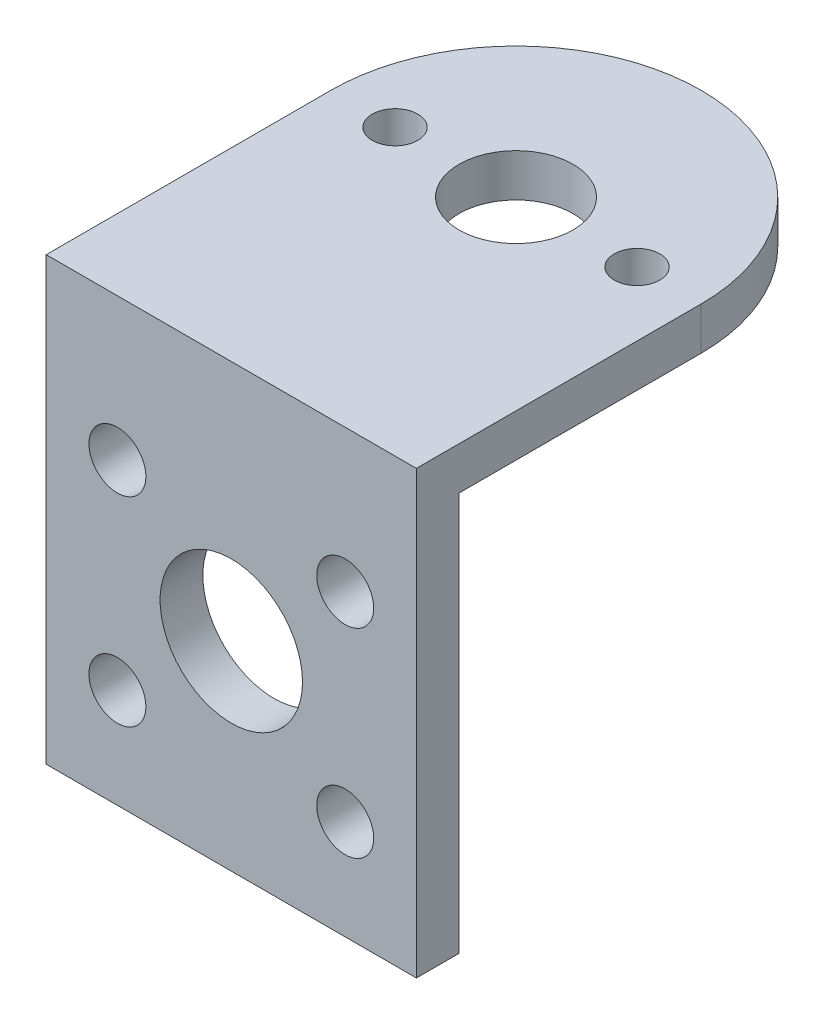
ISO-10303-21;
HEADER;
FILE_DESCRIPTION(('STEP AP214'),'2;1');
FILE_NAME('part.step','',(''),(''),'','','');
FILE_SCHEMA(('AUTOMOTIVE_DESIGN { 1 0 10303 214 1 1 1 1 }'));
ENDSEC;
DATA;
#1=APPLICATION_CONTEXT('core data for automotive mechanical design processes');
#2=APPLICATION_PROTOCOL_DEFINITION('international standard','automotive_design',2000,#1);
#3=PRODUCT_CONTEXT('',#1,'mechanical');
#4=PRODUCT('Part','Part','',(#3));
#5=PRODUCT_RELATED_PRODUCT_CATEGORY('part','',(#4));
#6=PRODUCT_DEFINITION_FORMATION('','',#4);
#7=PRODUCT_DEFINITION_CONTEXT('part definition',#1,'design');
#8=PRODUCT_DEFINITION('design','',#6,#7);
#9=PRODUCT_DEFINITION_SHAPE('','',#8);
#10=(LENGTH_UNIT() NAMED_UNIT(*) SI_UNIT(.MILLI.,.METRE.));
#11=(NAMED_UNIT(*) PLANE_ANGLE_UNIT() SI_UNIT($,.RADIAN.));
#12=(NAMED_UNIT(*) SI_UNIT($,.STERADIAN.) SOLID_ANGLE_UNIT());
#13=UNCERTAINTY_MEASURE_WITH_UNIT(LENGTH_MEASURE(1.E-05),#10,'distance_accuracy_value','');
#14=(GEOMETRIC_REPRESENTATION_CONTEXT(3) GLOBAL_UNCERTAINTY_ASSIGNED_CONTEXT((#13)) GLOBAL_UNIT_ASSIGNED_CONTEXT((#10,
#11,#12)) REPRESENTATION_CONTEXT('',''));
#15=CARTESIAN_POINT('',(0.,0.,0.));
#16=DIRECTION('',(0.,0.,1.));
#17=DIRECTION('',(1.,0.,0.));
#18=AXIS2_PLACEMENT_3D('',#15,#16,#17);
#19=CARTESIAN_POINT('',(0.,0.,0.));
#20=DIRECTION('',(0.,1.,0.));
#21=DIRECTION('',(0.,0.,1.));
#22=AXIS2_PLACEMENT_3D('',#19,#20,#21);
#23=PLANE('',#22);
#24=CARTESIAN_POINT('',(8.5,0.,0.));
#25=DIRECTION('',(0.,1.,0.));
#26=DIRECTION('',(0.,0.,1.));
#27=AXIS2_PLACEMENT_3D('',#24,#25,#26);
#28=CIRCLE('',#27,1.6);
#29=CARTESIAN_POINT('',(8.5,0.,1.6));
#30=VERTEX_POINT('',#29);
#31=EDGE_CURVE('E147',#30,#30,#28,.T.);
#32=ORIENTED_EDGE('',*,*,#31,.T.);
#33=EDGE_LOOP('',(#32));
#34=FACE_BOUND('',#33,.T.);
#35=CARTESIAN_POINT('',(0.,0.,0.));
#36=DIRECTION('',(0.,1.,0.));
#37=DIRECTION('',(0.,0.,1.));
#38=AXIS2_PLACEMENT_3D('',#35,#36,#37);
#39=CIRCLE('',#38,4.);
#40=CARTESIAN_POINT('',(0.,0.,4.));
#41=VERTEX_POINT('',#40);
#42=EDGE_CURVE('E157',#41,#41,#39,.T.);
#43=ORIENTED_EDGE('',*,*,#42,.T.);
#44=EDGE_LOOP('',(#43));
#45=FACE_BOUND('',#44,.T.);
#46=CARTESIAN_POINT('',(-8.5,0.,0.));
#47=DIRECTION('',(0.,1.,0.));
#48=DIRECTION('',(0.,0.,1.));
#49=AXIS2_PLACEMENT_3D('',#46,#47,#48);
#50=CIRCLE('',#49,1.6);
#51=CARTESIAN_POINT('',(-8.5,0.,1.6));
#52=VERTEX_POINT('',#51);
#53=EDGE_CURVE('E151',#52,#52,#50,.T.);
#54=ORIENTED_EDGE('',*,*,#53,.T.);
#55=EDGE_LOOP('',(#54));
#56=FACE_BOUND('',#55,.T.);
#57=DIRECTION('',(1.,0.,0.));
#58=VECTOR('',#57,1.);
#59=CARTESIAN_POINT('',(0.,0.,17.));
#60=LINE('',#59,#58);
#61=CARTESIAN_POINT('',(-13.,0.,17.));
#62=VERTEX_POINT('',#61);
#63=CARTESIAN_POINT('',(13.,0.,17.));
#64=VERTEX_POINT('',#63);
#65=EDGE_CURVE('E133',#62,#64,#60,.T.);
#66=ORIENTED_EDGE('',*,*,#65,.F.);
#67=DIRECTION('',(0.,0.,1.));
#68=VECTOR('',#67,1.);
#69=CARTESIAN_POINT('',(-13.,0.,0.));
#70=LINE('',#69,#68);
#71=CARTESIAN_POINT('',(-13.,0.,0.));
#72=VERTEX_POINT('',#71);
#73=EDGE_CURVE('E63',#72,#62,#70,.T.);
#74=ORIENTED_EDGE('',*,*,#73,.F.);
#75=CARTESIAN_POINT('',(0.,0.,0.));
#76=DIRECTION('',(0.,1.,0.));
#77=DIRECTION('',(0.,0.,1.));
#78=AXIS2_PLACEMENT_3D('',#75,#76,#77);
#79=CIRCLE('',#78,13.);
#80=CARTESIAN_POINT('',(13.,0.,0.));
#81=VERTEX_POINT('',#80);
#82=EDGE_CURVE('E110',#81,#72,#79,.T.);
#83=ORIENTED_EDGE('',*,*,#82,.F.);
#84=DIRECTION('',(0.,0.,-1.));
#85=VECTOR('',#84,1.);
#86=CARTESIAN_POINT('',(13.,0.,19.9999999999999));
#87=LINE('',#86,#85);
#88=EDGE_CURVE('E115',#64,#81,#87,.T.);
#89=ORIENTED_EDGE('',*,*,#88,.F.);
#90=EDGE_LOOP('',(#66,#74,#83,#89));
#91=FACE_BOUND('',#90,.T.);
#92=ADVANCED_FACE('F34',(#34,#45,#56,#91),#23,.F.);
#93=CARTESIAN_POINT('',(0.,3.,0.));
#94=DIRECTION('',(0.,1.,0.));
#95=DIRECTION('',(0.,0.,1.));
#96=AXIS2_PLACEMENT_3D('',#93,#94,#95);
#97=PLANE('',#96);
#98=DIRECTION('',(0.,0.,-1.));
#99=VECTOR('',#98,1.);
#100=CARTESIAN_POINT('',(13.,3.,19.9999999999999));
#101=LINE('',#100,#99);
#102=CARTESIAN_POINT('',(13.,3.,19.9999999999999));
#103=VERTEX_POINT('',#102);
#104=CARTESIAN_POINT('',(13.,3.,0.));
#105=VERTEX_POINT('',#104);
#106=EDGE_CURVE('E51',#103,#105,#101,.T.);
#107=ORIENTED_EDGE('',*,*,#106,.T.);
#108=CARTESIAN_POINT('',(0.,3.,0.));
#109=DIRECTION('',(0.,1.,0.));
#110=DIRECTION('',(0.,0.,1.));
#111=AXIS2_PLACEMENT_3D('',#108,#109,#110);
#112=CIRCLE('',#111,13.);
#113=CARTESIAN_POINT('',(-13.,3.,0.));
#114=VERTEX_POINT('',#113);
#115=EDGE_CURVE('E88',#105,#114,#112,.T.);
#116=ORIENTED_EDGE('',*,*,#115,.T.);
#117=DIRECTION('',(0.,0.,1.));
#118=VECTOR('',#117,1.);
#119=CARTESIAN_POINT('',(-13.,3.,0.));
#120=LINE('',#119,#118);
#121=CARTESIAN_POINT('',(-13.,3.,20.));
#122=VERTEX_POINT('',#121);
#123=EDGE_CURVE('E80',#114,#122,#120,.T.);
#124=ORIENTED_EDGE('',*,*,#123,.T.);
#125=DIRECTION('',(1.,0.,0.));
#126=VECTOR('',#125,1.);
#127=CARTESIAN_POINT('',(-13.,3.,20.));
#128=LINE('',#127,#126);
#129=EDGE_CURVE('E85',#122,#103,#128,.T.);
#130=ORIENTED_EDGE('',*,*,#129,.T.);
#131=EDGE_LOOP('',(#107,#116,#124,#130));
#132=FACE_BOUND('',#131,.T.);
#133=CARTESIAN_POINT('',(8.5,3.,0.));
#134=DIRECTION('',(0.,1.,0.));
#135=DIRECTION('',(0.,0.,1.));
#136=AXIS2_PLACEMENT_3D('',#133,#134,#135);
#137=CIRCLE('',#136,1.6);
#138=CARTESIAN_POINT('',(8.5,3.,1.6));
#139=VERTEX_POINT('',#138);
#140=EDGE_CURVE('E148',#139,#139,#137,.T.);
#141=ORIENTED_EDGE('',*,*,#140,.F.);
#142=EDGE_LOOP('',(#141));
#143=FACE_BOUND('',#142,.T.);
#144=CARTESIAN_POINT('',(0.,3.,0.));
#145=DIRECTION('',(0.,1.,0.));
#146=DIRECTION('',(0.,0.,1.));
#147=AXIS2_PLACEMENT_3D('',#144,#145,#146);
#148=CIRCLE('',#147,4.);
#149=CARTESIAN_POINT('',(0.,3.,4.));
#150=VERTEX_POINT('',#149);
#151=EDGE_CURVE('E113',#150,#150,#148,.T.);
#152=ORIENTED_EDGE('',*,*,#151,.F.);
#153=EDGE_LOOP('',(#152));
#154=FACE_BOUND('',#153,.T.);
#155=CARTESIAN_POINT('',(-8.5,3.,0.));
#156=DIRECTION('',(0.,1.,0.));
#157=DIRECTION('',(0.,0.,1.));
#158=AXIS2_PLACEMENT_3D('',#155,#156,#157);
#159=CIRCLE('',#158,1.6);
#160=CARTESIAN_POINT('',(-8.5,3.,1.6));
#161=VERTEX_POINT('',#160);
#162=EDGE_CURVE('E154',#161,#161,#159,.T.);
#163=ORIENTED_EDGE('',*,*,#162,.F.);
#164=EDGE_LOOP('',(#163));
#165=FACE_BOUND('',#164,.T.);
#166=ADVANCED_FACE('F82',(#132,#143,#154,#165),#97,.T.);
#167=CARTESIAN_POINT('',(0.,3.,0.));
#168=DIRECTION('',(0.,-1.,0.));
#169=DIRECTION('',(0.,0.,-1.));
#170=AXIS2_PLACEMENT_3D('',#167,#168,#169);
#171=CYLINDRICAL_SURFACE('',#170,13.);
#172=ORIENTED_EDGE('',*,*,#82,.T.);
#173=DIRECTION('',(0.,-1.,0.));
#174=VECTOR('',#173,1.);
#175=CARTESIAN_POINT('',(-13.,3.,0.));
#176=LINE('',#175,#174);
#177=EDGE_CURVE('E11',#114,#72,#176,.T.);
#178=ORIENTED_EDGE('',*,*,#177,.F.);
#179=ORIENTED_EDGE('',*,*,#115,.F.);
#180=DIRECTION('',(0.,-1.,0.));
#181=VECTOR('',#180,1.);
#182=CARTESIAN_POINT('',(13.,3.,0.));
#183=LINE('',#182,#181);
#184=EDGE_CURVE('E106',#105,#81,#183,.T.);
#185=ORIENTED_EDGE('',*,*,#184,.T.);
#186=EDGE_LOOP('',(#172,#178,#179,#185));
#187=FACE_BOUND('',#186,.T.);
#188=ADVANCED_FACE('F36',(#187),#171,.T.);
#189=CARTESIAN_POINT('',(-13.,3.,0.));
#190=DIRECTION('',(1.,0.,0.));
#191=DIRECTION('',(0.,0.,-1.));
#192=AXIS2_PLACEMENT_3D('',#189,#190,#191);
#193=PLANE('',#192);
#194=DIRECTION('',(0.,-1.,0.));
#195=VECTOR('',#194,1.);
#196=CARTESIAN_POINT('',(-13.,3.,20.));
#197=LINE('',#196,#195);
#198=CARTESIAN_POINT('',(-13.,-28.,20.));
#199=VERTEX_POINT('',#198);
#200=EDGE_CURVE('E43',#122,#199,#197,.T.);
#201=ORIENTED_EDGE('',*,*,#200,.F.);
#202=ORIENTED_EDGE('',*,*,#123,.F.);
#203=ORIENTED_EDGE('',*,*,#177,.T.);
#204=ORIENTED_EDGE('',*,*,#73,.T.);
#205=DIRECTION('',(0.,-1.,0.));
#206=VECTOR('',#205,1.);
#207=CARTESIAN_POINT('',(-13.,3.,17.));
#208=LINE('',#207,#206);
#209=CARTESIAN_POINT('',(-13.,-28.,17.));
#210=VERTEX_POINT('',#209);
#211=EDGE_CURVE('E73',#62,#210,#208,.T.);
#212=ORIENTED_EDGE('',*,*,#211,.T.);
#213=DIRECTION('',(0.,0.,1.));
#214=VECTOR('',#213,1.);
#215=CARTESIAN_POINT('',(-13.,-28.,17.));
#216=LINE('',#215,#214);
#217=EDGE_CURVE('E97',#210,#199,#216,.T.);
#218=ORIENTED_EDGE('',*,*,#217,.T.);
#219=EDGE_LOOP('',(#201,#202,#203,#204,#212,#218));
#220=FACE_BOUND('',#219,.T.);
#221=ADVANCED_FACE('F94',(#220),#193,.F.);
#222=CARTESIAN_POINT('',(-13.,3.,20.));
#223=DIRECTION('',(0.,0.,-1.));
#224=DIRECTION('',(-1.,0.,0.));
#225=AXIS2_PLACEMENT_3D('',#222,#223,#224);
#226=PLANE('',#225);
#227=ORIENTED_EDGE('',*,*,#200,.T.);
#228=DIRECTION('',(1.,0.,0.));
#229=VECTOR('',#228,1.);
#230=CARTESIAN_POINT('',(-13.,-28.,20.));
#231=LINE('',#230,#229);
#232=CARTESIAN_POINT('',(13.,-28.,20.));
#233=VERTEX_POINT('',#232);
#234=EDGE_CURVE('E130',#199,#233,#231,.T.);
#235=ORIENTED_EDGE('',*,*,#234,.T.);
#236=DIRECTION('',(0.,-1.,0.));
#237=VECTOR('',#236,1.);
#238=CARTESIAN_POINT('',(13.,3.,19.9999999999999));
#239=LINE('',#238,#237);
#240=EDGE_CURVE('E101',#103,#233,#239,.T.);
#241=ORIENTED_EDGE('',*,*,#240,.F.);
#242=ORIENTED_EDGE('',*,*,#129,.F.);
#243=EDGE_LOOP('',(#227,#235,#241,#242));
#244=FACE_BOUND('',#243,.T.);
#245=CARTESIAN_POINT('',(0.,-14.,20.));
#246=DIRECTION('',(0.,0.,1.));
#247=DIRECTION('',(1.,0.,0.));
#248=AXIS2_PLACEMENT_3D('',#245,#246,#247);
#249=CIRCLE('',#248,5.);
#250=CARTESIAN_POINT('',(5.00000000000008,-14.,20.));
#251=VERTEX_POINT('',#250);
#252=EDGE_CURVE('E139',#251,#251,#249,.T.);
#253=ORIENTED_EDGE('',*,*,#252,.F.);
#254=EDGE_LOOP('',(#253));
#255=FACE_BOUND('',#254,.T.);
#256=CARTESIAN_POINT('',(-7.99999999999992,-7.,20.));
#257=DIRECTION('',(0.,0.,1.));
#258=DIRECTION('',(1.,0.,0.));
#259=AXIS2_PLACEMENT_3D('',#256,#257,#258);
#260=CIRCLE('',#259,2.);
#261=CARTESIAN_POINT('',(-5.99999999999992,-7.,20.));
#262=VERTEX_POINT('',#261);
#263=EDGE_CURVE('E201',#262,#262,#260,.T.);
#264=ORIENTED_EDGE('',*,*,#263,.F.);
#265=EDGE_LOOP('',(#264));
#266=FACE_BOUND('',#265,.T.);
#267=CARTESIAN_POINT('',(8.00000000000008,-7.,20.));
#268=DIRECTION('',(0.,0.,1.));
#269=DIRECTION('',(1.,0.,0.));
#270=AXIS2_PLACEMENT_3D('',#267,#268,#269);
#271=CIRCLE('',#270,2.);
#272=CARTESIAN_POINT('',(10.0000000000001,-7.,20.));
#273=VERTEX_POINT('',#272);
#274=EDGE_CURVE('E207',#273,#273,#271,.T.);
#275=ORIENTED_EDGE('',*,*,#274,.F.);
#276=EDGE_LOOP('',(#275));
#277=FACE_BOUND('',#276,.T.);
#278=CARTESIAN_POINT('',(8.00000000000008,-21.,20.));
#279=DIRECTION('',(0.,0.,1.));
#280=DIRECTION('',(1.,0.,0.));
#281=AXIS2_PLACEMENT_3D('',#278,#279,#280);
#282=CIRCLE('',#281,2.);
#283=CARTESIAN_POINT('',(10.0000000000001,-21.,20.));
#284=VERTEX_POINT('',#283);
#285=EDGE_CURVE('E213',#284,#284,#282,.T.);
#286=ORIENTED_EDGE('',*,*,#285,.F.);
#287=EDGE_LOOP('',(#286));
#288=FACE_BOUND('',#287,.T.);
#289=CARTESIAN_POINT('',(-7.99999999999976,-21.,20.));
#290=DIRECTION('',(0.,0.,1.));
#291=DIRECTION('',(1.,0.,0.));
#292=AXIS2_PLACEMENT_3D('',#289,#290,#291);
#293=CIRCLE('',#292,2.);
#294=CARTESIAN_POINT('',(-5.99999999999976,-21.,20.));
#295=VERTEX_POINT('',#294);
#296=EDGE_CURVE('E219',#295,#295,#293,.T.);
#297=ORIENTED_EDGE('',*,*,#296,.F.);
#298=EDGE_LOOP('',(#297));
#299=FACE_BOUND('',#298,.T.);
#300=ADVANCED_FACE('F102',(#244,#255,#266,#277,#288,#299),#226,.F.);
#301=CARTESIAN_POINT('',(13.,3.,19.9999999999999));
#302=DIRECTION('',(-1.,0.,0.));
#303=DIRECTION('',(0.,0.,1.));
#304=AXIS2_PLACEMENT_3D('',#301,#302,#303);
#305=PLANE('',#304);
#306=ORIENTED_EDGE('',*,*,#240,.T.);
#307=DIRECTION('',(0.,0.,1.));
#308=VECTOR('',#307,1.);
#309=CARTESIAN_POINT('',(13.,-28.,17.));
#310=LINE('',#309,#308);
#311=CARTESIAN_POINT('',(13.,-28.,17.));
#312=VERTEX_POINT('',#311);
#313=EDGE_CURVE('E125',#312,#233,#310,.T.);
#314=ORIENTED_EDGE('',*,*,#313,.F.);
#315=DIRECTION('',(0.,1.,0.));
#316=VECTOR('',#315,1.);
#317=CARTESIAN_POINT('',(13.,-28.,17.));
#318=LINE('',#317,#316);
#319=EDGE_CURVE('E142',#312,#64,#318,.T.);
#320=ORIENTED_EDGE('',*,*,#319,.T.);
#321=ORIENTED_EDGE('',*,*,#88,.T.);
#322=ORIENTED_EDGE('',*,*,#184,.F.);
#323=ORIENTED_EDGE('',*,*,#106,.F.);
#324=EDGE_LOOP('',(#306,#314,#320,#321,#322,#323));
#325=FACE_BOUND('',#324,.T.);
#326=ADVANCED_FACE('F123',(#325),#305,.F.);
#327=CARTESIAN_POINT('',(0.,3.,0.));
#328=DIRECTION('',(0.,-1.,0.));
#329=DIRECTION('',(0.,0.,-1.));
#330=AXIS2_PLACEMENT_3D('',#327,#328,#329);
#331=CYLINDRICAL_SURFACE('',#330,4.);
#332=ORIENTED_EDGE('',*,*,#151,.T.);
#333=EDGE_LOOP('',(#332));
#334=FACE_BOUND('',#333,.T.);
#335=ORIENTED_EDGE('',*,*,#42,.F.);
#336=EDGE_LOOP('',(#335));
#337=FACE_BOUND('',#336,.T.);
#338=ADVANCED_FACE('F167',(#334,#337),#331,.F.);
#339=CARTESIAN_POINT('',(-8.5,3.,0.));
#340=DIRECTION('',(0.,-1.,0.));
#341=DIRECTION('',(0.,0.,-1.));
#342=AXIS2_PLACEMENT_3D('',#339,#340,#341);
#343=CYLINDRICAL_SURFACE('',#342,1.6);
#344=ORIENTED_EDGE('',*,*,#162,.T.);
#345=EDGE_LOOP('',(#344));
#346=FACE_BOUND('',#345,.T.);
#347=ORIENTED_EDGE('',*,*,#53,.F.);
#348=EDGE_LOOP('',(#347));
#349=FACE_BOUND('',#348,.T.);
#350=ADVANCED_FACE('F169',(#346,#349),#343,.F.);
#351=CARTESIAN_POINT('',(8.5,3.,0.));
#352=DIRECTION('',(0.,-1.,0.));
#353=DIRECTION('',(0.,0.,-1.));
#354=AXIS2_PLACEMENT_3D('',#351,#352,#353);
#355=CYLINDRICAL_SURFACE('',#354,1.6);
#356=ORIENTED_EDGE('',*,*,#140,.T.);
#357=EDGE_LOOP('',(#356));
#358=FACE_BOUND('',#357,.T.);
#359=ORIENTED_EDGE('',*,*,#31,.F.);
#360=EDGE_LOOP('',(#359));
#361=FACE_BOUND('',#360,.T.);
#362=ADVANCED_FACE('F176',(#358,#361),#355,.F.);
#363=CARTESIAN_POINT('',(0.,0.,17.));
#364=DIRECTION('',(0.,0.,1.));
#365=DIRECTION('',(1.,0.,0.));
#366=AXIS2_PLACEMENT_3D('',#363,#364,#365);
#367=PLANE('',#366);
#368=CARTESIAN_POINT('',(0.,-14.,17.));
#369=DIRECTION('',(0.,0.,1.));
#370=DIRECTION('',(1.,0.,0.));
#371=AXIS2_PLACEMENT_3D('',#368,#369,#370);
#372=CIRCLE('',#371,5.);
#373=CARTESIAN_POINT('',(5.00000000000008,-14.,17.));
#374=VERTEX_POINT('',#373);
#375=EDGE_CURVE('E135',#374,#374,#372,.T.);
#376=ORIENTED_EDGE('',*,*,#375,.T.);
#377=EDGE_LOOP('',(#376));
#378=FACE_BOUND('',#377,.T.);
#379=CARTESIAN_POINT('',(-7.99999999999992,-7.,17.));
#380=DIRECTION('',(0.,0.,1.));
#381=DIRECTION('',(1.,0.,0.));
#382=AXIS2_PLACEMENT_3D('',#379,#380,#381);
#383=CIRCLE('',#382,2.);
#384=CARTESIAN_POINT('',(-5.99999999999992,-7.,17.));
#385=VERTEX_POINT('',#384);
#386=EDGE_CURVE('E199',#385,#385,#383,.T.);
#387=ORIENTED_EDGE('',*,*,#386,.T.);
#388=EDGE_LOOP('',(#387));
#389=FACE_BOUND('',#388,.T.);
#390=CARTESIAN_POINT('',(8.00000000000008,-7.,17.));
#391=DIRECTION('',(0.,0.,1.));
#392=DIRECTION('',(1.,0.,0.));
#393=AXIS2_PLACEMENT_3D('',#390,#391,#392);
#394=CIRCLE('',#393,2.);
#395=CARTESIAN_POINT('',(10.0000000000001,-7.,17.));
#396=VERTEX_POINT('',#395);
#397=EDGE_CURVE('E204',#396,#396,#394,.T.);
#398=ORIENTED_EDGE('',*,*,#397,.T.);
#399=EDGE_LOOP('',(#398));
#400=FACE_BOUND('',#399,.T.);
#401=CARTESIAN_POINT('',(8.00000000000008,-21.,17.));
#402=DIRECTION('',(0.,0.,1.));
#403=DIRECTION('',(1.,0.,0.));
#404=AXIS2_PLACEMENT_3D('',#401,#402,#403);
#405=CIRCLE('',#404,2.);
#406=CARTESIAN_POINT('',(10.0000000000001,-21.,17.));
#407=VERTEX_POINT('',#406);
#408=EDGE_CURVE('E210',#407,#407,#405,.T.);
#409=ORIENTED_EDGE('',*,*,#408,.T.);
#410=EDGE_LOOP('',(#409));
#411=FACE_BOUND('',#410,.T.);
#412=CARTESIAN_POINT('',(-7.99999999999976,-21.,17.));
#413=DIRECTION('',(0.,0.,1.));
#414=DIRECTION('',(1.,0.,0.));
#415=AXIS2_PLACEMENT_3D('',#412,#413,#414);
#416=CIRCLE('',#415,2.);
#417=CARTESIAN_POINT('',(-5.99999999999976,-21.,17.));
#418=VERTEX_POINT('',#417);
#419=EDGE_CURVE('E216',#418,#418,#416,.T.);
#420=ORIENTED_EDGE('',*,*,#419,.T.);
#421=EDGE_LOOP('',(#420));
#422=FACE_BOUND('',#421,.T.);
#423=ORIENTED_EDGE('',*,*,#211,.F.);
#424=ORIENTED_EDGE('',*,*,#65,.T.);
#425=ORIENTED_EDGE('',*,*,#319,.F.);
#426=DIRECTION('',(1.,0.,0.));
#427=VECTOR('',#426,1.);
#428=CARTESIAN_POINT('',(-13.,-28.,17.));
#429=LINE('',#428,#427);
#430=EDGE_CURVE('E131',#210,#312,#429,.T.);
#431=ORIENTED_EDGE('',*,*,#430,.F.);
#432=EDGE_LOOP('',(#423,#424,#425,#431));
#433=FACE_BOUND('',#432,.T.);
#434=ADVANCED_FACE('F225',(#378,#389,#400,#411,#422,#433),#367,.F.);
#435=CARTESIAN_POINT('',(-13.,-28.,17.));
#436=DIRECTION('',(0.,-1.,0.));
#437=DIRECTION('',(0.,0.,-1.));
#438=AXIS2_PLACEMENT_3D('',#435,#436,#437);
#439=PLANE('',#438);
#440=ORIENTED_EDGE('',*,*,#234,.F.);
#441=ORIENTED_EDGE('',*,*,#217,.F.);
#442=ORIENTED_EDGE('',*,*,#430,.T.);
#443=ORIENTED_EDGE('',*,*,#313,.T.);
#444=EDGE_LOOP('',(#440,#441,#442,#443));
#445=FACE_BOUND('',#444,.T.);
#446=ADVANCED_FACE('F129',(#445),#439,.T.);
#447=CARTESIAN_POINT('',(0.,-14.,17.));
#448=DIRECTION('',(0.,0.,1.));
#449=DIRECTION('',(1.,0.,0.));
#450=AXIS2_PLACEMENT_3D('',#447,#448,#449);
#451=CYLINDRICAL_SURFACE('',#450,5.);
#452=ORIENTED_EDGE('',*,*,#375,.F.);
#453=EDGE_LOOP('',(#452));
#454=FACE_BOUND('',#453,.T.);
#455=ORIENTED_EDGE('',*,*,#252,.T.);
#456=EDGE_LOOP('',(#455));
#457=FACE_BOUND('',#456,.T.);
#458=ADVANCED_FACE('F247',(#454,#457),#451,.F.);
#459=CARTESIAN_POINT('',(-7.99999999999992,-7.,17.));
#460=DIRECTION('',(0.,0.,1.));
#461=DIRECTION('',(1.,0.,0.));
#462=AXIS2_PLACEMENT_3D('',#459,#460,#461);
#463=CYLINDRICAL_SURFACE('',#462,2.);
#464=ORIENTED_EDGE('',*,*,#386,.F.);
#465=EDGE_LOOP('',(#464));
#466=FACE_BOUND('',#465,.T.);
#467=ORIENTED_EDGE('',*,*,#263,.T.);
#468=EDGE_LOOP('',(#467));
#469=FACE_BOUND('',#468,.T.);
#470=ADVANCED_FACE('F243',(#466,#469),#463,.F.);
#471=CARTESIAN_POINT('',(8.00000000000008,-7.,17.));
#472=DIRECTION('',(0.,0.,1.));
#473=DIRECTION('',(1.,0.,0.));
#474=AXIS2_PLACEMENT_3D('',#471,#472,#473);
#475=CYLINDRICAL_SURFACE('',#474,2.);
#476=ORIENTED_EDGE('',*,*,#397,.F.);
#477=EDGE_LOOP('',(#476));
#478=FACE_BOUND('',#477,.T.);
#479=ORIENTED_EDGE('',*,*,#274,.T.);
#480=EDGE_LOOP('',(#479));
#481=FACE_BOUND('',#480,.T.);
#482=ADVANCED_FACE('F237',(#478,#481),#475,.F.);
#483=CARTESIAN_POINT('',(8.00000000000008,-21.,17.));
#484=DIRECTION('',(0.,0.,1.));
#485=DIRECTION('',(1.,0.,0.));
#486=AXIS2_PLACEMENT_3D('',#483,#484,#485);
#487=CYLINDRICAL_SURFACE('',#486,2.);
#488=ORIENTED_EDGE('',*,*,#408,.F.);
#489=EDGE_LOOP('',(#488));
#490=FACE_BOUND('',#489,.T.);
#491=ORIENTED_EDGE('',*,*,#285,.T.);
#492=EDGE_LOOP('',(#491));
#493=FACE_BOUND('',#492,.T.);
#494=ADVANCED_FACE('F230',(#490,#493),#487,.F.);
#495=CARTESIAN_POINT('',(-7.99999999999976,-21.,17.));
#496=DIRECTION('',(0.,0.,1.));
#497=DIRECTION('',(1.,0.,0.));
#498=AXIS2_PLACEMENT_3D('',#495,#496,#497);
#499=CYLINDRICAL_SURFACE('',#498,2.);
#500=ORIENTED_EDGE('',*,*,#419,.F.);
#501=EDGE_LOOP('',(#500));
#502=FACE_BOUND('',#501,.T.);
#503=ORIENTED_EDGE('',*,*,#296,.T.);
#504=EDGE_LOOP('',(#503));
#505=FACE_BOUND('',#504,.T.);
#506=ADVANCED_FACE('F227',(#502,#505),#499,.F.);
#507=CLOSED_SHELL('',(#92,#166,#188,#221,#300,#326,#338,#350,#362,#434,#446,#458,#470,#482,#494,#506));
#508=MANIFOLD_SOLID_BREP('B2',#507);
#509=ADVANCED_BREP_SHAPE_REPRESENTATION('',(#18,#508),#14);
#510=SHAPE_DEFINITION_REPRESENTATION(#9,#509);
ENDSEC;
END-ISO-10303-21;
